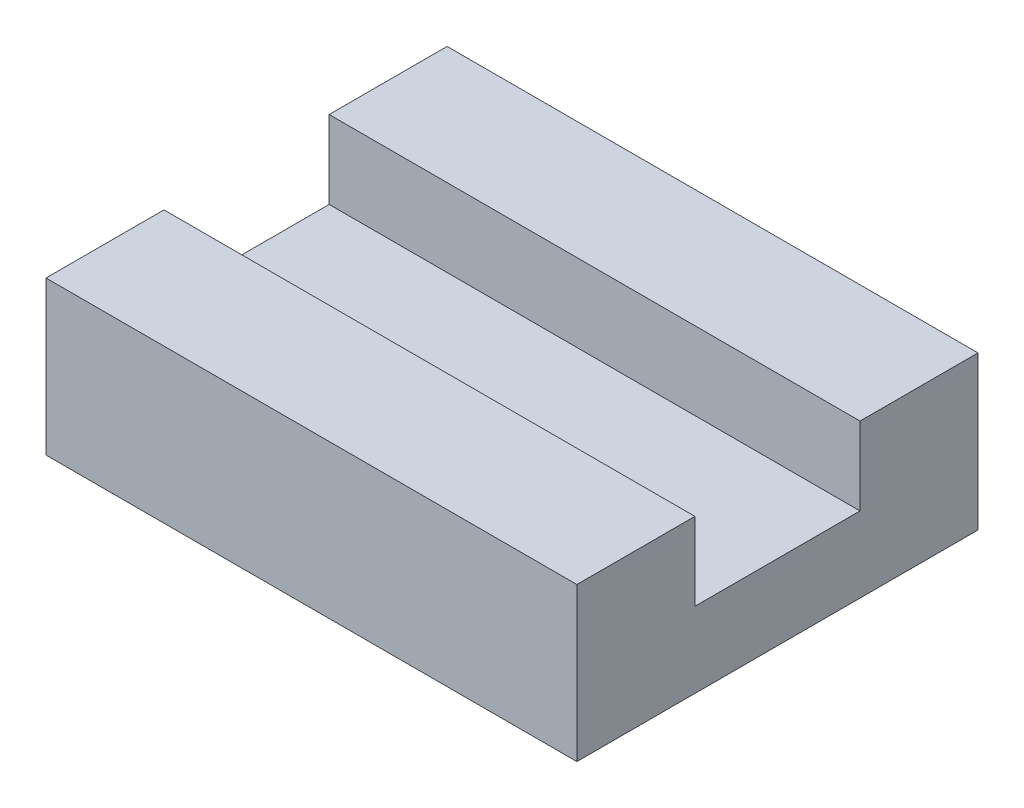
ISO-10303-21;
HEADER;
FILE_DESCRIPTION(('STEP AP214'),'2;1');
FILE_NAME('part.step','',(''),(''),'','','');
FILE_SCHEMA(('AUTOMOTIVE_DESIGN { 1 0 10303 214 1 1 1 1 }'));
ENDSEC;
DATA;
#1=APPLICATION_CONTEXT('core data for automotive mechanical design processes');
#2=APPLICATION_PROTOCOL_DEFINITION('international standard','automotive_design',2000,#1);
#3=PRODUCT_CONTEXT('',#1,'mechanical');
#4=PRODUCT('Part','Part','',(#3));
#5=PRODUCT_RELATED_PRODUCT_CATEGORY('part','',(#4));
#6=PRODUCT_DEFINITION_FORMATION('','',#4);
#7=PRODUCT_DEFINITION_CONTEXT('part definition',#1,'design');
#8=PRODUCT_DEFINITION('design','',#6,#7);
#9=PRODUCT_DEFINITION_SHAPE('','',#8);
#10=(LENGTH_UNIT() NAMED_UNIT(*) SI_UNIT(.MILLI.,.METRE.));
#11=(NAMED_UNIT(*) PLANE_ANGLE_UNIT() SI_UNIT($,.RADIAN.));
#12=(NAMED_UNIT(*) SI_UNIT($,.STERADIAN.) SOLID_ANGLE_UNIT());
#13=UNCERTAINTY_MEASURE_WITH_UNIT(LENGTH_MEASURE(1.E-05),#10,'distance_accuracy_value','');
#14=(GEOMETRIC_REPRESENTATION_CONTEXT(3) GLOBAL_UNCERTAINTY_ASSIGNED_CONTEXT((#13)) GLOBAL_UNIT_ASSIGNED_CONTEXT((#10,
#11,#12)) REPRESENTATION_CONTEXT('',''));
#15=CARTESIAN_POINT('',(0.,0.,0.));
#16=DIRECTION('',(0.,0.,1.));
#17=DIRECTION('',(1.,0.,0.));
#18=AXIS2_PLACEMENT_3D('',#15,#16,#17);
#19=CARTESIAN_POINT('',(11.25,6.5,8.5));
#20=DIRECTION('',(0.,1.,0.));
#21=DIRECTION('',(0.,0.,1.));
#22=AXIS2_PLACEMENT_3D('',#19,#20,#21);
#23=PLANE('',#22);
#24=DIRECTION('',(0.,0.,-1.));
#25=VECTOR('',#24,1.);
#26=CARTESIAN_POINT('',(-11.25,6.5,8.5));
#27=LINE('',#26,#25);
#28=CARTESIAN_POINT('',(-11.25,6.5,8.5));
#29=VERTEX_POINT('',#28);
#30=CARTESIAN_POINT('',(-11.25,6.5,3.5));
#31=VERTEX_POINT('',#30);
#32=EDGE_CURVE('E130',#29,#31,#27,.T.);
#33=ORIENTED_EDGE('',*,*,#32,.F.);
#34=DIRECTION('',(-1.,0.,0.));
#35=VECTOR('',#34,1.);
#36=CARTESIAN_POINT('',(11.25,6.5,8.5));
#37=LINE('',#36,#35);
#38=CARTESIAN_POINT('',(11.25,6.5,8.5));
#39=VERTEX_POINT('',#38);
#40=EDGE_CURVE('E11',#39,#29,#37,.T.);
#41=ORIENTED_EDGE('',*,*,#40,.F.);
#42=DIRECTION('',(0.,0.,-1.));
#43=VECTOR('',#42,1.);
#44=CARTESIAN_POINT('',(11.25,6.5,8.5));
#45=LINE('',#44,#43);
#46=CARTESIAN_POINT('',(11.25,6.5,3.5));
#47=VERTEX_POINT('',#46);
#48=EDGE_CURVE('E150',#39,#47,#45,.T.);
#49=ORIENTED_EDGE('',*,*,#48,.T.);
#50=DIRECTION('',(-1.,0.,0.));
#51=VECTOR('',#50,1.);
#52=CARTESIAN_POINT('',(11.25,6.5,3.5));
#53=LINE('',#52,#51);
#54=EDGE_CURVE('E36',#47,#31,#53,.T.);
#55=ORIENTED_EDGE('',*,*,#54,.T.);
#56=EDGE_LOOP('',(#33,#41,#49,#55));
#57=FACE_BOUND('',#56,.T.);
#58=ADVANCED_FACE('F33',(#57),#23,.T.);
#59=CARTESIAN_POINT('',(11.25,0.,8.5));
#60=DIRECTION('',(0.,0.,1.));
#61=DIRECTION('',(1.,0.,0.));
#62=AXIS2_PLACEMENT_3D('',#59,#60,#61);
#63=PLANE('',#62);
#64=DIRECTION('',(0.,1.,0.));
#65=VECTOR('',#64,1.);
#66=CARTESIAN_POINT('',(-11.25,0.,8.5));
#67=LINE('',#66,#65);
#68=CARTESIAN_POINT('',(-11.25,0.,8.5));
#69=VERTEX_POINT('',#68);
#70=EDGE_CURVE('E148',#69,#29,#67,.T.);
#71=ORIENTED_EDGE('',*,*,#70,.F.);
#72=DIRECTION('',(-1.,0.,0.));
#73=VECTOR('',#72,1.);
#74=CARTESIAN_POINT('',(11.25,0.,8.5));
#75=LINE('',#74,#73);
#76=CARTESIAN_POINT('',(11.25,0.,8.5));
#77=VERTEX_POINT('',#76);
#78=EDGE_CURVE('E42',#77,#69,#75,.T.);
#79=ORIENTED_EDGE('',*,*,#78,.F.);
#80=DIRECTION('',(0.,1.,0.));
#81=VECTOR('',#80,1.);
#82=CARTESIAN_POINT('',(11.25,0.,8.5));
#83=LINE('',#82,#81);
#84=EDGE_CURVE('E120',#77,#39,#83,.T.);
#85=ORIENTED_EDGE('',*,*,#84,.T.);
#86=ORIENTED_EDGE('',*,*,#40,.T.);
#87=EDGE_LOOP('',(#71,#79,#85,#86));
#88=FACE_BOUND('',#87,.T.);
#89=ADVANCED_FACE('F162',(#88),#63,.T.);
#90=CARTESIAN_POINT('',(11.25,0.,-8.5));
#91=DIRECTION('',(0.,-1.,0.));
#92=DIRECTION('',(0.,0.,-1.));
#93=AXIS2_PLACEMENT_3D('',#90,#91,#92);
#94=PLANE('',#93);
#95=DIRECTION('',(0.,0.,1.));
#96=VECTOR('',#95,1.);
#97=CARTESIAN_POINT('',(-11.25,0.,-8.5));
#98=LINE('',#97,#96);
#99=CARTESIAN_POINT('',(-11.25,0.,-8.5));
#100=VERTEX_POINT('',#99);
#101=EDGE_CURVE('E107',#100,#69,#98,.T.);
#102=ORIENTED_EDGE('',*,*,#101,.F.);
#103=DIRECTION('',(-1.,0.,0.));
#104=VECTOR('',#103,1.);
#105=CARTESIAN_POINT('',(11.25,0.,-8.5));
#106=LINE('',#105,#104);
#107=CARTESIAN_POINT('',(11.25,0.,-8.5));
#108=VERTEX_POINT('',#107);
#109=EDGE_CURVE('E102',#108,#100,#106,.T.);
#110=ORIENTED_EDGE('',*,*,#109,.F.);
#111=DIRECTION('',(0.,0.,1.));
#112=VECTOR('',#111,1.);
#113=CARTESIAN_POINT('',(11.25,0.,-8.5));
#114=LINE('',#113,#112);
#115=EDGE_CURVE('E105',#108,#77,#114,.T.);
#116=ORIENTED_EDGE('',*,*,#115,.T.);
#117=ORIENTED_EDGE('',*,*,#78,.T.);
#118=EDGE_LOOP('',(#102,#110,#116,#117));
#119=FACE_BOUND('',#118,.T.);
#120=ADVANCED_FACE('F104',(#119),#94,.T.);
#121=CARTESIAN_POINT('',(11.25,6.5,-8.5));
#122=DIRECTION('',(0.,0.,-1.));
#123=DIRECTION('',(-1.,0.,0.));
#124=AXIS2_PLACEMENT_3D('',#121,#122,#123);
#125=PLANE('',#124);
#126=DIRECTION('',(0.,-1.,0.));
#127=VECTOR('',#126,1.);
#128=CARTESIAN_POINT('',(-11.25,6.5,-8.5));
#129=LINE('',#128,#127);
#130=CARTESIAN_POINT('',(-11.25,6.5,-8.5));
#131=VERTEX_POINT('',#130);
#132=EDGE_CURVE('E145',#131,#100,#129,.T.);
#133=ORIENTED_EDGE('',*,*,#132,.F.);
#134=DIRECTION('',(-1.,0.,0.));
#135=VECTOR('',#134,1.);
#136=CARTESIAN_POINT('',(11.25,6.5,-8.5));
#137=LINE('',#136,#135);
#138=CARTESIAN_POINT('',(11.25,6.5,-8.5));
#139=VERTEX_POINT('',#138);
#140=EDGE_CURVE('E112',#139,#131,#137,.T.);
#141=ORIENTED_EDGE('',*,*,#140,.F.);
#142=DIRECTION('',(0.,-1.,0.));
#143=VECTOR('',#142,1.);
#144=CARTESIAN_POINT('',(11.25,6.5,-8.5));
#145=LINE('',#144,#143);
#146=EDGE_CURVE('E118',#139,#108,#145,.T.);
#147=ORIENTED_EDGE('',*,*,#146,.T.);
#148=ORIENTED_EDGE('',*,*,#109,.T.);
#149=EDGE_LOOP('',(#133,#141,#147,#148));
#150=FACE_BOUND('',#149,.T.);
#151=ADVANCED_FACE('F122',(#150),#125,.T.);
#152=CARTESIAN_POINT('',(11.25,6.5,-3.5));
#153=DIRECTION('',(0.,1.,0.));
#154=DIRECTION('',(0.,0.,1.));
#155=AXIS2_PLACEMENT_3D('',#152,#153,#154);
#156=PLANE('',#155);
#157=DIRECTION('',(0.,0.,-1.));
#158=VECTOR('',#157,1.);
#159=CARTESIAN_POINT('',(-11.25,6.5,-3.5));
#160=LINE('',#159,#158);
#161=CARTESIAN_POINT('',(-11.25,6.5,-3.5));
#162=VERTEX_POINT('',#161);
#163=EDGE_CURVE('E142',#162,#131,#160,.T.);
#164=ORIENTED_EDGE('',*,*,#163,.F.);
#165=DIRECTION('',(-1.,0.,0.));
#166=VECTOR('',#165,1.);
#167=CARTESIAN_POINT('',(11.25,6.5,-3.5));
#168=LINE('',#167,#166);
#169=CARTESIAN_POINT('',(11.25,6.5,-3.5));
#170=VERTEX_POINT('',#169);
#171=EDGE_CURVE('E154',#170,#162,#168,.T.);
#172=ORIENTED_EDGE('',*,*,#171,.F.);
#173=DIRECTION('',(0.,0.,-1.));
#174=VECTOR('',#173,1.);
#175=CARTESIAN_POINT('',(11.25,6.5,-3.5));
#176=LINE('',#175,#174);
#177=EDGE_CURVE('E123',#170,#139,#176,.T.);
#178=ORIENTED_EDGE('',*,*,#177,.T.);
#179=ORIENTED_EDGE('',*,*,#140,.T.);
#180=EDGE_LOOP('',(#164,#172,#178,#179));
#181=FACE_BOUND('',#180,.T.);
#182=ADVANCED_FACE('F175',(#181),#156,.T.);
#183=CARTESIAN_POINT('',(11.25,3.2,-3.5));
#184=DIRECTION('',(0.,0.,1.));
#185=DIRECTION('',(1.,0.,0.));
#186=AXIS2_PLACEMENT_3D('',#183,#184,#185);
#187=PLANE('',#186);
#188=DIRECTION('',(0.,1.,0.));
#189=VECTOR('',#188,1.);
#190=CARTESIAN_POINT('',(-11.25,3.2,-3.5));
#191=LINE('',#190,#189);
#192=CARTESIAN_POINT('',(-11.25,3.2,-3.5));
#193=VERTEX_POINT('',#192);
#194=EDGE_CURVE('E139',#193,#162,#191,.T.);
#195=ORIENTED_EDGE('',*,*,#194,.F.);
#196=DIRECTION('',(-1.,0.,0.));
#197=VECTOR('',#196,1.);
#198=CARTESIAN_POINT('',(11.25,3.2,-3.5));
#199=LINE('',#198,#197);
#200=CARTESIAN_POINT('',(11.25,3.2,-3.5));
#201=VERTEX_POINT('',#200);
#202=EDGE_CURVE('E156',#201,#193,#199,.T.);
#203=ORIENTED_EDGE('',*,*,#202,.F.);
#204=DIRECTION('',(0.,1.,0.));
#205=VECTOR('',#204,1.);
#206=CARTESIAN_POINT('',(11.25,3.2,-3.5));
#207=LINE('',#206,#205);
#208=EDGE_CURVE('E125',#201,#170,#207,.T.);
#209=ORIENTED_EDGE('',*,*,#208,.T.);
#210=ORIENTED_EDGE('',*,*,#171,.T.);
#211=EDGE_LOOP('',(#195,#203,#209,#210));
#212=FACE_BOUND('',#211,.T.);
#213=ADVANCED_FACE('F178',(#212),#187,.T.);
#214=CARTESIAN_POINT('',(11.25,3.2,3.5));
#215=DIRECTION('',(0.,1.,0.));
#216=DIRECTION('',(0.,0.,1.));
#217=AXIS2_PLACEMENT_3D('',#214,#215,#216);
#218=PLANE('',#217);
#219=DIRECTION('',(0.,0.,-1.));
#220=VECTOR('',#219,1.);
#221=CARTESIAN_POINT('',(-11.25,3.2,3.5));
#222=LINE('',#221,#220);
#223=CARTESIAN_POINT('',(-11.25,3.2,3.5));
#224=VERTEX_POINT('',#223);
#225=EDGE_CURVE('E136',#224,#193,#222,.T.);
#226=ORIENTED_EDGE('',*,*,#225,.F.);
#227=DIRECTION('',(-1.,0.,0.));
#228=VECTOR('',#227,1.);
#229=CARTESIAN_POINT('',(11.25,3.2,3.5));
#230=LINE('',#229,#228);
#231=CARTESIAN_POINT('',(11.25,3.2,3.5));
#232=VERTEX_POINT('',#231);
#233=EDGE_CURVE('E157',#232,#224,#230,.T.);
#234=ORIENTED_EDGE('',*,*,#233,.F.);
#235=DIRECTION('',(0.,0.,-1.));
#236=VECTOR('',#235,1.);
#237=CARTESIAN_POINT('',(11.25,3.2,3.5));
#238=LINE('',#237,#236);
#239=EDGE_CURVE('E253',#232,#201,#238,.T.);
#240=ORIENTED_EDGE('',*,*,#239,.T.);
#241=ORIENTED_EDGE('',*,*,#202,.T.);
#242=EDGE_LOOP('',(#226,#234,#240,#241));
#243=FACE_BOUND('',#242,.T.);
#244=ADVANCED_FACE('F182',(#243),#218,.T.);
#245=CARTESIAN_POINT('',(11.25,6.5,3.5));
#246=DIRECTION('',(0.,0.,-1.));
#247=DIRECTION('',(-1.,0.,0.));
#248=AXIS2_PLACEMENT_3D('',#245,#246,#247);
#249=PLANE('',#248);
#250=DIRECTION('',(0.,-1.,0.));
#251=VECTOR('',#250,1.);
#252=CARTESIAN_POINT('',(-11.25,6.5,3.5));
#253=LINE('',#252,#251);
#254=EDGE_CURVE('E133',#31,#224,#253,.T.);
#255=ORIENTED_EDGE('',*,*,#254,.F.);
#256=ORIENTED_EDGE('',*,*,#54,.F.);
#257=DIRECTION('',(0.,-1.,0.));
#258=VECTOR('',#257,1.);
#259=CARTESIAN_POINT('',(11.25,6.5,3.5));
#260=LINE('',#259,#258);
#261=EDGE_CURVE('E254',#47,#232,#260,.T.);
#262=ORIENTED_EDGE('',*,*,#261,.T.);
#263=ORIENTED_EDGE('',*,*,#233,.T.);
#264=EDGE_LOOP('',(#255,#256,#262,#263));
#265=FACE_BOUND('',#264,.T.);
#266=ADVANCED_FACE('F159',(#265),#249,.T.);
#267=CARTESIAN_POINT('',(11.25,0.,0.));
#268=DIRECTION('',(-1.,0.,0.));
#269=DIRECTION('',(0.,0.,1.));
#270=AXIS2_PLACEMENT_3D('',#267,#268,#269);
#271=PLANE('',#270);
#272=ORIENTED_EDGE('',*,*,#48,.F.);
#273=ORIENTED_EDGE('',*,*,#84,.F.);
#274=ORIENTED_EDGE('',*,*,#115,.F.);
#275=ORIENTED_EDGE('',*,*,#146,.F.);
#276=ORIENTED_EDGE('',*,*,#177,.F.);
#277=ORIENTED_EDGE('',*,*,#208,.F.);
#278=ORIENTED_EDGE('',*,*,#239,.F.);
#279=ORIENTED_EDGE('',*,*,#261,.F.);
#280=EDGE_LOOP('',(#272,#273,#274,#275,#276,#277,#278,#279));
#281=FACE_BOUND('',#280,.T.);
#282=ADVANCED_FACE('F116',(#281),#271,.F.);
#283=CARTESIAN_POINT('',(-11.25,0.,0.));
#284=DIRECTION('',(-1.,0.,0.));
#285=DIRECTION('',(0.,0.,1.));
#286=AXIS2_PLACEMENT_3D('',#283,#284,#285);
#287=PLANE('',#286);
#288=ORIENTED_EDGE('',*,*,#32,.T.);
#289=ORIENTED_EDGE('',*,*,#254,.T.);
#290=ORIENTED_EDGE('',*,*,#225,.T.);
#291=ORIENTED_EDGE('',*,*,#194,.T.);
#292=ORIENTED_EDGE('',*,*,#163,.T.);
#293=ORIENTED_EDGE('',*,*,#132,.T.);
#294=ORIENTED_EDGE('',*,*,#101,.T.);
#295=ORIENTED_EDGE('',*,*,#70,.T.);
#296=EDGE_LOOP('',(#288,#289,#290,#291,#292,#293,#294,#295));
#297=FACE_BOUND('',#296,.T.);
#298=ADVANCED_FACE('F161',(#297),#287,.T.);
#299=CLOSED_SHELL('',(#58,#89,#120,#151,#182,#213,#244,#266,#282,#298));
#300=MANIFOLD_SOLID_BREP('B2',#299);
#301=ADVANCED_BREP_SHAPE_REPRESENTATION('',(#18,#300),#14);
#302=SHAPE_DEFINITION_REPRESENTATION(#9,#301);
ENDSEC;
END-ISO-10303-21;
